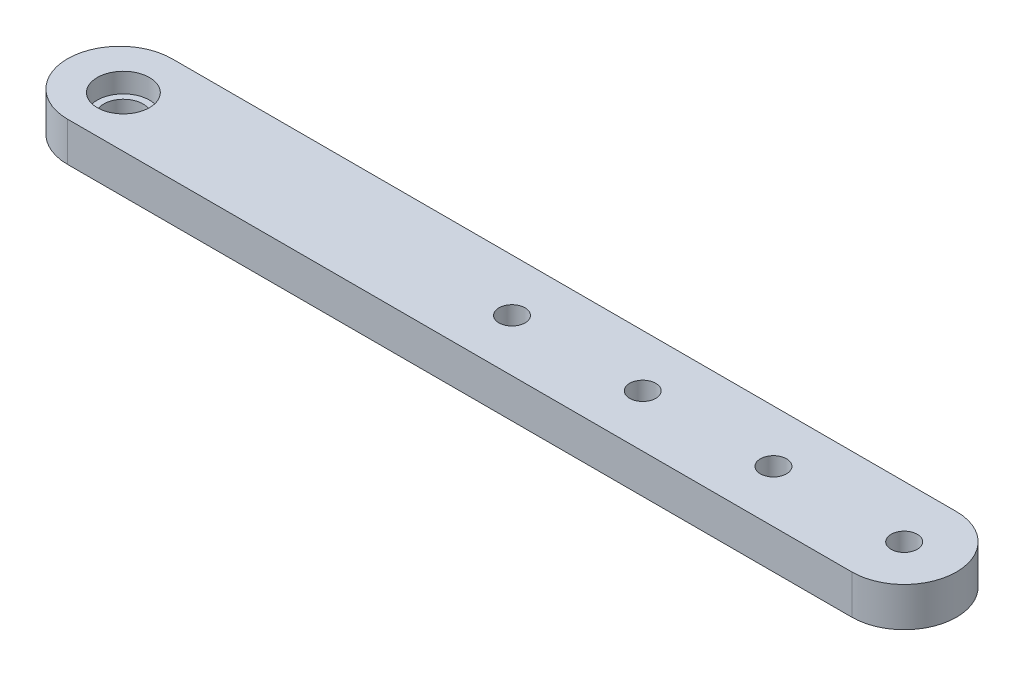
ISO-10303-21;
HEADER;
FILE_DESCRIPTION(('STEP AP214'),'2;1');
FILE_NAME('part.step','',(''),(''),'','','');
FILE_SCHEMA(('AUTOMOTIVE_DESIGN { 1 0 10303 214 1 1 1 1 }'));
ENDSEC;
DATA;
#1=APPLICATION_CONTEXT('core data for automotive mechanical design processes');
#2=APPLICATION_PROTOCOL_DEFINITION('international standard','automotive_design',2000,#1);
#3=PRODUCT_CONTEXT('',#1,'mechanical');
#4=PRODUCT('Part','Part','',(#3));
#5=PRODUCT_RELATED_PRODUCT_CATEGORY('part','',(#4));
#6=PRODUCT_DEFINITION_FORMATION('','',#4);
#7=PRODUCT_DEFINITION_CONTEXT('part definition',#1,'design');
#8=PRODUCT_DEFINITION('design','',#6,#7);
#9=PRODUCT_DEFINITION_SHAPE('','',#8);
#10=(LENGTH_UNIT() NAMED_UNIT(*) SI_UNIT(.MILLI.,.METRE.));
#11=(NAMED_UNIT(*) PLANE_ANGLE_UNIT() SI_UNIT($,.RADIAN.));
#12=(NAMED_UNIT(*) SI_UNIT($,.STERADIAN.) SOLID_ANGLE_UNIT());
#13=UNCERTAINTY_MEASURE_WITH_UNIT(LENGTH_MEASURE(1.E-05),#10,'distance_accuracy_value','');
#14=(GEOMETRIC_REPRESENTATION_CONTEXT(3) GLOBAL_UNCERTAINTY_ASSIGNED_CONTEXT((#13)) GLOBAL_UNIT_ASSIGNED_CONTEXT((#10,
#11,#12)) REPRESENTATION_CONTEXT('',''));
#15=CARTESIAN_POINT('',(0.,0.,0.));
#16=DIRECTION('',(0.,0.,1.));
#17=DIRECTION('',(1.,0.,0.));
#18=AXIS2_PLACEMENT_3D('',#15,#16,#17);
#19=CARTESIAN_POINT('',(-59.243309236767,6.,0.211557175716284));
#20=DIRECTION('',(0.,-1.,0.));
#21=DIRECTION('',(0.,0.,-1.));
#22=AXIS2_PLACEMENT_3D('',#19,#20,#21);
#23=CYLINDRICAL_SURFACE('',#22,3.);
#24=CARTESIAN_POINT('',(-59.243309236767,0.,0.211557175716284));
#25=DIRECTION('',(0.,1.,0.));
#26=DIRECTION('',(0.,0.,1.));
#27=AXIS2_PLACEMENT_3D('',#24,#25,#26);
#28=CIRCLE('',#27,3.);
#29=CARTESIAN_POINT('',(-59.243309236767,0.,3.21155717571629));
#30=VERTEX_POINT('',#29);
#31=EDGE_CURVE('E106',#30,#30,#28,.T.);
#32=ORIENTED_EDGE('',*,*,#31,.F.);
#33=EDGE_LOOP('',(#32));
#34=FACE_BOUND('',#33,.T.);
#35=CARTESIAN_POINT('',(-59.243309236767,3.,0.211557175716284));
#36=DIRECTION('',(0.,1.,0.));
#37=DIRECTION('',(0.,0.,1.));
#38=AXIS2_PLACEMENT_3D('',#35,#36,#37);
#39=CIRCLE('',#38,3.);
#40=CARTESIAN_POINT('',(-59.243309236767,3.,3.21155717571629));
#41=VERTEX_POINT('',#40);
#42=EDGE_CURVE('E40',#41,#41,#39,.T.);
#43=ORIENTED_EDGE('',*,*,#42,.T.);
#44=EDGE_LOOP('',(#43));
#45=FACE_BOUND('',#44,.T.);
#46=ADVANCED_FACE('F36',(#34,#45),#23,.F.);
#47=CARTESIAN_POINT('',(60.,6.,0.));
#48=DIRECTION('',(0.,1.,0.));
#49=DIRECTION('',(0.,0.,1.));
#50=AXIS2_PLACEMENT_3D('',#47,#48,#49);
#51=PLANE('',#50);
#52=CARTESIAN_POINT('',(-59.243309236767,6.,0.211557175716284));
#53=DIRECTION('',(0.,1.,0.));
#54=DIRECTION('',(0.,0.,1.));
#55=AXIS2_PLACEMENT_3D('',#52,#53,#54);
#56=CIRCLE('',#55,4.);
#57=CARTESIAN_POINT('',(-59.243309236767,6.,4.21155717571628));
#58=VERTEX_POINT('',#57);
#59=EDGE_CURVE('E144',#58,#58,#56,.T.);
#60=ORIENTED_EDGE('',*,*,#59,.F.);
#61=EDGE_LOOP('',(#60));
#62=FACE_BOUND('',#61,.T.);
#63=CARTESIAN_POINT('',(40.,6.,0.));
#64=DIRECTION('',(0.,1.,0.));
#65=DIRECTION('',(0.,0.,1.));
#66=AXIS2_PLACEMENT_3D('',#63,#64,#65);
#67=CIRCLE('',#66,2.);
#68=CARTESIAN_POINT('',(40.,6.,2.));
#69=VERTEX_POINT('',#68);
#70=EDGE_CURVE('E130',#69,#69,#67,.T.);
#71=ORIENTED_EDGE('',*,*,#70,.F.);
#72=EDGE_LOOP('',(#71));
#73=FACE_BOUND('',#72,.T.);
#74=CARTESIAN_POINT('',(60.,6.,0.));
#75=DIRECTION('',(0.,1.,0.));
#76=DIRECTION('',(0.,0.,1.));
#77=AXIS2_PLACEMENT_3D('',#74,#75,#76);
#78=CIRCLE('',#77,2.);
#79=CARTESIAN_POINT('',(60.,6.,2.));
#80=VERTEX_POINT('',#79);
#81=EDGE_CURVE('E120',#80,#80,#78,.T.);
#82=ORIENTED_EDGE('',*,*,#81,.F.);
#83=EDGE_LOOP('',(#82));
#84=FACE_BOUND('',#83,.T.);
#85=CARTESIAN_POINT('',(60.,6.,0.));
#86=DIRECTION('',(0.,1.,0.));
#87=DIRECTION('',(0.,0.,1.));
#88=AXIS2_PLACEMENT_3D('',#85,#86,#87);
#89=CIRCLE('',#88,8.);
#90=CARTESIAN_POINT('',(60.,6.,8.));
#91=VERTEX_POINT('',#90);
#92=CARTESIAN_POINT('',(60.,6.,-8.));
#93=VERTEX_POINT('',#92);
#94=EDGE_CURVE('E90',#91,#93,#89,.T.);
#95=ORIENTED_EDGE('',*,*,#94,.T.);
#96=DIRECTION('',(-1.,0.,0.));
#97=VECTOR('',#96,1.);
#98=CARTESIAN_POINT('',(-60.,6.,-8.));
#99=LINE('',#98,#97);
#100=CARTESIAN_POINT('',(-60.,6.,-8.));
#101=VERTEX_POINT('',#100);
#102=EDGE_CURVE('E84',#93,#101,#99,.T.);
#103=ORIENTED_EDGE('',*,*,#102,.T.);
#104=CARTESIAN_POINT('',(-60.,6.,0.));
#105=DIRECTION('',(0.,1.,0.));
#106=DIRECTION('',(0.,0.,1.));
#107=AXIS2_PLACEMENT_3D('',#104,#105,#106);
#108=CIRCLE('',#107,8.);
#109=CARTESIAN_POINT('',(-60.,6.,8.));
#110=VERTEX_POINT('',#109);
#111=EDGE_CURVE('E88',#101,#110,#108,.T.);
#112=ORIENTED_EDGE('',*,*,#111,.T.);
#113=DIRECTION('',(1.,0.,0.));
#114=VECTOR('',#113,1.);
#115=CARTESIAN_POINT('',(-60.,6.,8.));
#116=LINE('',#115,#114);
#117=EDGE_CURVE('E54',#110,#91,#116,.T.);
#118=ORIENTED_EDGE('',*,*,#117,.T.);
#119=EDGE_LOOP('',(#95,#103,#112,#118));
#120=FACE_BOUND('',#119,.T.);
#121=CARTESIAN_POINT('',(20.,6.,0.));
#122=DIRECTION('',(0.,1.,0.));
#123=DIRECTION('',(0.,0.,1.));
#124=AXIS2_PLACEMENT_3D('',#121,#122,#123);
#125=CIRCLE('',#124,2.);
#126=CARTESIAN_POINT('',(20.,6.,2.));
#127=VERTEX_POINT('',#126);
#128=EDGE_CURVE('E124',#127,#127,#125,.T.);
#129=ORIENTED_EDGE('',*,*,#128,.F.);
#130=EDGE_LOOP('',(#129));
#131=FACE_BOUND('',#130,.T.);
#132=CARTESIAN_POINT('',(0.,6.,0.));
#133=DIRECTION('',(0.,1.,0.));
#134=DIRECTION('',(0.,0.,1.));
#135=AXIS2_PLACEMENT_3D('',#132,#133,#134);
#136=CIRCLE('',#135,2.);
#137=CARTESIAN_POINT('',(0.,6.,2.));
#138=VERTEX_POINT('',#137);
#139=EDGE_CURVE('E136',#138,#138,#136,.T.);
#140=ORIENTED_EDGE('',*,*,#139,.F.);
#141=EDGE_LOOP('',(#140));
#142=FACE_BOUND('',#141,.T.);
#143=ADVANCED_FACE('F85',(#62,#73,#84,#120,#131,#142),#51,.T.);
#144=CARTESIAN_POINT('',(60.,0.,0.));
#145=DIRECTION('',(0.,1.,0.));
#146=DIRECTION('',(0.,0.,1.));
#147=AXIS2_PLACEMENT_3D('',#144,#145,#146);
#148=PLANE('',#147);
#149=CARTESIAN_POINT('',(60.,0.,0.));
#150=DIRECTION('',(0.,1.,0.));
#151=DIRECTION('',(0.,0.,1.));
#152=AXIS2_PLACEMENT_3D('',#149,#150,#151);
#153=CIRCLE('',#152,8.);
#154=CARTESIAN_POINT('',(60.,0.,8.));
#155=VERTEX_POINT('',#154);
#156=CARTESIAN_POINT('',(60.,0.,-8.));
#157=VERTEX_POINT('',#156);
#158=EDGE_CURVE('E103',#155,#157,#153,.T.);
#159=ORIENTED_EDGE('',*,*,#158,.F.);
#160=DIRECTION('',(1.,0.,0.));
#161=VECTOR('',#160,1.);
#162=CARTESIAN_POINT('',(-60.,0.,8.));
#163=LINE('',#162,#161);
#164=CARTESIAN_POINT('',(-60.,0.,8.));
#165=VERTEX_POINT('',#164);
#166=EDGE_CURVE('E77',#165,#155,#163,.T.);
#167=ORIENTED_EDGE('',*,*,#166,.F.);
#168=CARTESIAN_POINT('',(-60.,0.,0.));
#169=DIRECTION('',(0.,1.,0.));
#170=DIRECTION('',(0.,0.,1.));
#171=AXIS2_PLACEMENT_3D('',#168,#169,#170);
#172=CIRCLE('',#171,8.);
#173=CARTESIAN_POINT('',(-60.,0.,-8.));
#174=VERTEX_POINT('',#173);
#175=EDGE_CURVE('E71',#174,#165,#172,.T.);
#176=ORIENTED_EDGE('',*,*,#175,.F.);
#177=DIRECTION('',(-1.,0.,0.));
#178=VECTOR('',#177,1.);
#179=CARTESIAN_POINT('',(-60.,0.,-8.));
#180=LINE('',#179,#178);
#181=EDGE_CURVE('E94',#157,#174,#180,.T.);
#182=ORIENTED_EDGE('',*,*,#181,.F.);
#183=EDGE_LOOP('',(#159,#167,#176,#182));
#184=FACE_BOUND('',#183,.T.);
#185=ORIENTED_EDGE('',*,*,#31,.T.);
#186=EDGE_LOOP('',(#185));
#187=FACE_BOUND('',#186,.T.);
#188=CARTESIAN_POINT('',(60.,0.,0.));
#189=DIRECTION('',(0.,1.,0.));
#190=DIRECTION('',(0.,0.,1.));
#191=AXIS2_PLACEMENT_3D('',#188,#189,#190);
#192=CIRCLE('',#191,2.);
#193=CARTESIAN_POINT('',(60.,0.,2.));
#194=VERTEX_POINT('',#193);
#195=EDGE_CURVE('E121',#194,#194,#192,.T.);
#196=ORIENTED_EDGE('',*,*,#195,.T.);
#197=EDGE_LOOP('',(#196));
#198=FACE_BOUND('',#197,.T.);
#199=CARTESIAN_POINT('',(20.,0.,0.));
#200=DIRECTION('',(0.,1.,0.));
#201=DIRECTION('',(0.,0.,1.));
#202=AXIS2_PLACEMENT_3D('',#199,#200,#201);
#203=CIRCLE('',#202,2.);
#204=CARTESIAN_POINT('',(20.,0.,2.));
#205=VERTEX_POINT('',#204);
#206=EDGE_CURVE('E127',#205,#205,#203,.T.);
#207=ORIENTED_EDGE('',*,*,#206,.T.);
#208=EDGE_LOOP('',(#207));
#209=FACE_BOUND('',#208,.T.);
#210=CARTESIAN_POINT('',(40.,0.,0.));
#211=DIRECTION('',(0.,1.,0.));
#212=DIRECTION('',(0.,0.,1.));
#213=AXIS2_PLACEMENT_3D('',#210,#211,#212);
#214=CIRCLE('',#213,2.);
#215=CARTESIAN_POINT('',(40.,0.,2.));
#216=VERTEX_POINT('',#215);
#217=EDGE_CURVE('E133',#216,#216,#214,.T.);
#218=ORIENTED_EDGE('',*,*,#217,.T.);
#219=EDGE_LOOP('',(#218));
#220=FACE_BOUND('',#219,.T.);
#221=CARTESIAN_POINT('',(0.,0.,0.));
#222=DIRECTION('',(0.,1.,0.));
#223=DIRECTION('',(0.,0.,1.));
#224=AXIS2_PLACEMENT_3D('',#221,#222,#223);
#225=CIRCLE('',#224,2.);
#226=CARTESIAN_POINT('',(0.,0.,2.));
#227=VERTEX_POINT('',#226);
#228=EDGE_CURVE('E139',#227,#227,#225,.T.);
#229=ORIENTED_EDGE('',*,*,#228,.T.);
#230=EDGE_LOOP('',(#229));
#231=FACE_BOUND('',#230,.T.);
#232=ADVANCED_FACE('F114',(#184,#187,#198,#209,#220,#231),#148,.F.);
#233=CARTESIAN_POINT('',(60.,6.,0.));
#234=DIRECTION('',(0.,-1.,0.));
#235=DIRECTION('',(0.,0.,-1.));
#236=AXIS2_PLACEMENT_3D('',#233,#234,#235);
#237=CYLINDRICAL_SURFACE('',#236,8.);
#238=ORIENTED_EDGE('',*,*,#158,.T.);
#239=DIRECTION('',(0.,-1.,0.));
#240=VECTOR('',#239,1.);
#241=CARTESIAN_POINT('',(60.,6.,-8.));
#242=LINE('',#241,#240);
#243=EDGE_CURVE('E11',#93,#157,#242,.T.);
#244=ORIENTED_EDGE('',*,*,#243,.F.);
#245=ORIENTED_EDGE('',*,*,#94,.F.);
#246=DIRECTION('',(0.,-1.,0.));
#247=VECTOR('',#246,1.);
#248=CARTESIAN_POINT('',(60.,6.,8.));
#249=LINE('',#248,#247);
#250=EDGE_CURVE('E99',#91,#155,#249,.T.);
#251=ORIENTED_EDGE('',*,*,#250,.T.);
#252=EDGE_LOOP('',(#238,#244,#245,#251));
#253=FACE_BOUND('',#252,.T.);
#254=ADVANCED_FACE('F38',(#253),#237,.T.);
#255=CARTESIAN_POINT('',(-60.,6.,-8.));
#256=DIRECTION('',(0.,0.,1.));
#257=DIRECTION('',(1.,0.,0.));
#258=AXIS2_PLACEMENT_3D('',#255,#256,#257);
#259=PLANE('',#258);
#260=ORIENTED_EDGE('',*,*,#181,.T.);
#261=DIRECTION('',(0.,-1.,0.));
#262=VECTOR('',#261,1.);
#263=CARTESIAN_POINT('',(-60.,6.,-8.));
#264=LINE('',#263,#262);
#265=EDGE_CURVE('E46',#101,#174,#264,.T.);
#266=ORIENTED_EDGE('',*,*,#265,.F.);
#267=ORIENTED_EDGE('',*,*,#102,.F.);
#268=ORIENTED_EDGE('',*,*,#243,.T.);
#269=EDGE_LOOP('',(#260,#266,#267,#268));
#270=FACE_BOUND('',#269,.T.);
#271=ADVANCED_FACE('F93',(#270),#259,.F.);
#272=CARTESIAN_POINT('',(-60.,6.,0.));
#273=DIRECTION('',(0.,-1.,0.));
#274=DIRECTION('',(0.,0.,-1.));
#275=AXIS2_PLACEMENT_3D('',#272,#273,#274);
#276=CYLINDRICAL_SURFACE('',#275,8.);
#277=ORIENTED_EDGE('',*,*,#175,.T.);
#278=DIRECTION('',(0.,-1.,0.));
#279=VECTOR('',#278,1.);
#280=CARTESIAN_POINT('',(-60.,6.,8.));
#281=LINE('',#280,#279);
#282=EDGE_CURVE('E95',#110,#165,#281,.T.);
#283=ORIENTED_EDGE('',*,*,#282,.F.);
#284=ORIENTED_EDGE('',*,*,#111,.F.);
#285=ORIENTED_EDGE('',*,*,#265,.T.);
#286=EDGE_LOOP('',(#277,#283,#284,#285));
#287=FACE_BOUND('',#286,.T.);
#288=ADVANCED_FACE('F97',(#287),#276,.T.);
#289=CARTESIAN_POINT('',(-60.,6.,8.));
#290=DIRECTION('',(0.,0.,-1.));
#291=DIRECTION('',(-1.,0.,0.));
#292=AXIS2_PLACEMENT_3D('',#289,#290,#291);
#293=PLANE('',#292);
#294=ORIENTED_EDGE('',*,*,#166,.T.);
#295=ORIENTED_EDGE('',*,*,#250,.F.);
#296=ORIENTED_EDGE('',*,*,#117,.F.);
#297=ORIENTED_EDGE('',*,*,#282,.T.);
#298=EDGE_LOOP('',(#294,#295,#296,#297));
#299=FACE_BOUND('',#298,.T.);
#300=ADVANCED_FACE('F111',(#299),#293,.F.);
#301=CARTESIAN_POINT('',(60.,6.,0.));
#302=DIRECTION('',(0.,-1.,0.));
#303=DIRECTION('',(0.,0.,-1.));
#304=AXIS2_PLACEMENT_3D('',#301,#302,#303);
#305=CYLINDRICAL_SURFACE('',#304,2.);
#306=ORIENTED_EDGE('',*,*,#81,.T.);
#307=EDGE_LOOP('',(#306));
#308=FACE_BOUND('',#307,.T.);
#309=ORIENTED_EDGE('',*,*,#195,.F.);
#310=EDGE_LOOP('',(#309));
#311=FACE_BOUND('',#310,.T.);
#312=ADVANCED_FACE('F175',(#308,#311),#305,.F.);
#313=CARTESIAN_POINT('',(20.,6.,0.));
#314=DIRECTION('',(0.,-1.,0.));
#315=DIRECTION('',(0.,0.,-1.));
#316=AXIS2_PLACEMENT_3D('',#313,#314,#315);
#317=CYLINDRICAL_SURFACE('',#316,2.);
#318=ORIENTED_EDGE('',*,*,#128,.T.);
#319=EDGE_LOOP('',(#318));
#320=FACE_BOUND('',#319,.T.);
#321=ORIENTED_EDGE('',*,*,#206,.F.);
#322=EDGE_LOOP('',(#321));
#323=FACE_BOUND('',#322,.T.);
#324=ADVANCED_FACE('F225',(#320,#323),#317,.F.);
#325=CARTESIAN_POINT('',(40.,6.,0.));
#326=DIRECTION('',(0.,-1.,0.));
#327=DIRECTION('',(0.,0.,-1.));
#328=AXIS2_PLACEMENT_3D('',#325,#326,#327);
#329=CYLINDRICAL_SURFACE('',#328,2.);
#330=ORIENTED_EDGE('',*,*,#70,.T.);
#331=EDGE_LOOP('',(#330));
#332=FACE_BOUND('',#331,.T.);
#333=ORIENTED_EDGE('',*,*,#217,.F.);
#334=EDGE_LOOP('',(#333));
#335=FACE_BOUND('',#334,.T.);
#336=ADVANCED_FACE('F217',(#332,#335),#329,.F.);
#337=CARTESIAN_POINT('',(0.,6.,0.));
#338=DIRECTION('',(0.,-1.,0.));
#339=DIRECTION('',(0.,0.,-1.));
#340=AXIS2_PLACEMENT_3D('',#337,#338,#339);
#341=CYLINDRICAL_SURFACE('',#340,2.);
#342=ORIENTED_EDGE('',*,*,#139,.T.);
#343=EDGE_LOOP('',(#342));
#344=FACE_BOUND('',#343,.T.);
#345=ORIENTED_EDGE('',*,*,#228,.F.);
#346=EDGE_LOOP('',(#345));
#347=FACE_BOUND('',#346,.T.);
#348=ADVANCED_FACE('F162',(#344,#347),#341,.F.);
#349=CARTESIAN_POINT('',(-59.243309236767,3.,0.211557175716284));
#350=DIRECTION('',(0.,1.,0.));
#351=DIRECTION('',(0.,0.,1.));
#352=AXIS2_PLACEMENT_3D('',#349,#350,#351);
#353=CYLINDRICAL_SURFACE('',#352,4.);
#354=CARTESIAN_POINT('',(-59.243309236767,3.,0.211557175716284));
#355=DIRECTION('',(0.,1.,0.));
#356=DIRECTION('',(0.,0.,1.));
#357=AXIS2_PLACEMENT_3D('',#354,#355,#356);
#358=CIRCLE('',#357,4.);
#359=CARTESIAN_POINT('',(-59.243309236767,3.,4.21155717571628));
#360=VERTEX_POINT('',#359);
#361=EDGE_CURVE('E147',#360,#360,#358,.T.);
#362=ORIENTED_EDGE('',*,*,#361,.F.);
#363=EDGE_LOOP('',(#362));
#364=FACE_BOUND('',#363,.T.);
#365=ORIENTED_EDGE('',*,*,#59,.T.);
#366=EDGE_LOOP('',(#365));
#367=FACE_BOUND('',#366,.T.);
#368=ADVANCED_FACE('F157',(#364,#367),#353,.F.);
#369=CARTESIAN_POINT('',(-59.243309236767,3.,0.211557175716284));
#370=DIRECTION('',(0.,1.,0.));
#371=DIRECTION('',(0.,0.,1.));
#372=AXIS2_PLACEMENT_3D('',#369,#370,#371);
#373=PLANE('',#372);
#374=ORIENTED_EDGE('',*,*,#42,.F.);
#375=EDGE_LOOP('',(#374));
#376=FACE_BOUND('',#375,.T.);
#377=ORIENTED_EDGE('',*,*,#361,.T.);
#378=EDGE_LOOP('',(#377));
#379=FACE_BOUND('',#378,.T.);
#380=ADVANCED_FACE('F155',(#376,#379),#373,.T.);
#381=CLOSED_SHELL('',(#46,#143,#232,#254,#271,#288,#300,#312,#324,#336,#348,#368,#380));
#382=MANIFOLD_SOLID_BREP('B2',#381);
#383=ADVANCED_BREP_SHAPE_REPRESENTATION('',(#18,#382),#14);
#384=SHAPE_DEFINITION_REPRESENTATION(#9,#383);
ENDSEC;
END-ISO-10303-21;
